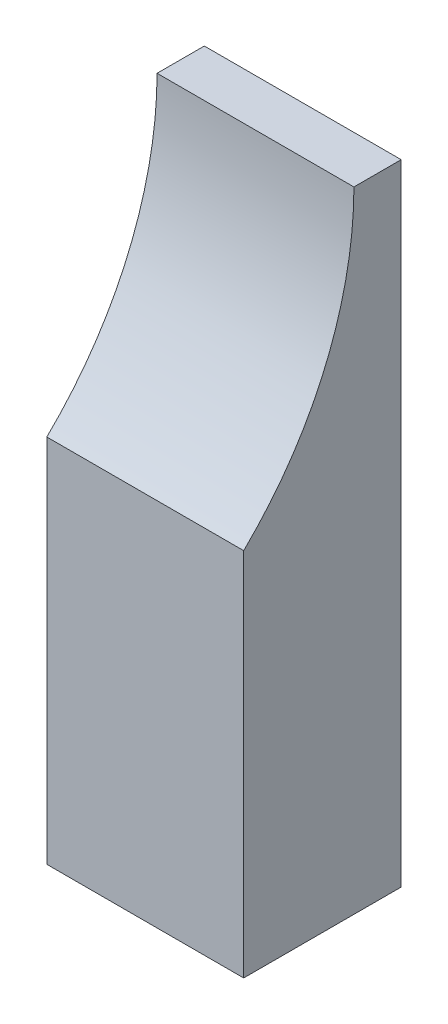
ISO-10303-21;
HEADER;
FILE_DESCRIPTION(('STEP AP214'),'2;1');
FILE_NAME('part.step','',(''),(''),'','','');
FILE_SCHEMA(('AUTOMOTIVE_DESIGN { 1 0 10303 214 1 1 1 1 }'));
ENDSEC;
DATA;
#1=APPLICATION_CONTEXT('core data for automotive mechanical design processes');
#2=APPLICATION_PROTOCOL_DEFINITION('international standard','automotive_design',2000,#1);
#3=PRODUCT_CONTEXT('',#1,'mechanical');
#4=PRODUCT('Part','Part','',(#3));
#5=PRODUCT_RELATED_PRODUCT_CATEGORY('part','',(#4));
#6=PRODUCT_DEFINITION_FORMATION('','',#4);
#7=PRODUCT_DEFINITION_CONTEXT('part definition',#1,'design');
#8=PRODUCT_DEFINITION('design','',#6,#7);
#9=PRODUCT_DEFINITION_SHAPE('','',#8);
#10=(LENGTH_UNIT() NAMED_UNIT(*) SI_UNIT(.MILLI.,.METRE.));
#11=(NAMED_UNIT(*) PLANE_ANGLE_UNIT() SI_UNIT($,.RADIAN.));
#12=(NAMED_UNIT(*) SI_UNIT($,.STERADIAN.) SOLID_ANGLE_UNIT());
#13=UNCERTAINTY_MEASURE_WITH_UNIT(LENGTH_MEASURE(1.E-05),#10,'distance_accuracy_value','');
#14=(GEOMETRIC_REPRESENTATION_CONTEXT(3) GLOBAL_UNCERTAINTY_ASSIGNED_CONTEXT((#13)) GLOBAL_UNIT_ASSIGNED_CONTEXT((#10,
#11,#12)) REPRESENTATION_CONTEXT('',''));
#15=CARTESIAN_POINT('',(0.,0.,0.));
#16=DIRECTION('',(0.,0.,1.));
#17=DIRECTION('',(1.,0.,0.));
#18=AXIS2_PLACEMENT_3D('',#15,#16,#17);
#19=CARTESIAN_POINT('',(0.,0.,0.2));
#20=DIRECTION('',(0.,0.,1.));
#21=DIRECTION('',(1.,0.,0.));
#22=AXIS2_PLACEMENT_3D('',#19,#20,#21);
#23=PLANE('',#22);
#24=DIRECTION('',(1.,0.,0.));
#25=VECTOR('',#24,1.);
#26=CARTESIAN_POINT('',(0.125,-0.4,0.2));
#27=LINE('',#26,#25);
#28=CARTESIAN_POINT('',(0.125,-0.4,0.200000000006667));
#29=VERTEX_POINT('',#28);
#30=CARTESIAN_POINT('',(-0.125,-0.4,0.2));
#31=VERTEX_POINT('',#30);
#32=EDGE_CURVE('E82',#29,#31,#27,.F.);
#33=ORIENTED_EDGE('',*,*,#32,.F.);
#34=DIRECTION('',(0.,1.,0.));
#35=VECTOR('',#34,1.);
#36=CARTESIAN_POINT('',(0.125,0.4,0.20000000001));
#37=LINE('',#36,#35);
#38=CARTESIAN_POINT('',(0.125,0.0699999999955797,0.200000000010092));
#39=VERTEX_POINT('',#38);
#40=EDGE_CURVE('E74',#39,#29,#37,.F.);
#41=ORIENTED_EDGE('',*,*,#40,.F.);
#42=DIRECTION('',(1.,0.,0.));
#43=VECTOR('',#42,1.);
#44=CARTESIAN_POINT('',(0.125,0.0699999999954906,0.200000000010185));
#45=LINE('',#44,#43);
#46=CARTESIAN_POINT('',(-0.125,0.070000000000412,0.200000000005092));
#47=VERTEX_POINT('',#46);
#48=EDGE_CURVE('E71',#39,#47,#45,.F.);
#49=ORIENTED_EDGE('',*,*,#48,.T.);
#50=DIRECTION('',(0.,1.,0.));
#51=VECTOR('',#50,1.);
#52=CARTESIAN_POINT('',(-0.125,-0.4,0.2));
#53=LINE('',#52,#51);
#54=EDGE_CURVE('E60',#31,#47,#53,.T.);
#55=ORIENTED_EDGE('',*,*,#54,.F.);
#56=EDGE_LOOP('',(#33,#41,#49,#55));
#57=FACE_BOUND('',#56,.T.);
#58=ADVANCED_FACE('F17',(#57),#23,.T.);
#59=CARTESIAN_POINT('',(0.125,0.4,0.518928571416));
#60=DIRECTION('',(1.,0.,0.));
#61=DIRECTION('',(0.,0.,-1.));
#62=AXIS2_PLACEMENT_3D('',#59,#60,#61);
#63=CYLINDRICAL_SURFACE('',#62,0.458928571416);
#64=CARTESIAN_POINT('',(-0.125,0.4,0.518928571416));
#65=DIRECTION('',(1.,0.,0.));
#66=DIRECTION('',(0.,0.,-1.));
#67=AXIS2_PLACEMENT_3D('',#64,#65,#66);
#68=CIRCLE('',#67,0.458928571416);
#69=CARTESIAN_POINT('',(-0.125,0.4,0.06));
#70=VERTEX_POINT('',#69);
#71=EDGE_CURVE('E20',#47,#70,#68,.T.);
#72=ORIENTED_EDGE('',*,*,#71,.F.);
#73=ORIENTED_EDGE('',*,*,#48,.F.);
#74=CARTESIAN_POINT('',(0.125,0.4,0.518928571416));
#75=DIRECTION('',(1.,0.,0.));
#76=DIRECTION('',(0.,0.,-1.));
#77=AXIS2_PLACEMENT_3D('',#74,#75,#76);
#78=CIRCLE('',#77,0.458928571416);
#79=CARTESIAN_POINT('',(0.125,0.4,0.06));
#80=VERTEX_POINT('',#79);
#81=EDGE_CURVE('E86',#80,#39,#78,.F.);
#82=ORIENTED_EDGE('',*,*,#81,.F.);
#83=DIRECTION('',(1.,0.,0.));
#84=VECTOR('',#83,1.);
#85=CARTESIAN_POINT('',(-0.125,0.4,0.06));
#86=LINE('',#85,#84);
#87=EDGE_CURVE('E81',#70,#80,#86,.T.);
#88=ORIENTED_EDGE('',*,*,#87,.F.);
#89=EDGE_LOOP('',(#72,#73,#82,#88));
#90=FACE_BOUND('',#89,.T.);
#91=ADVANCED_FACE('F80',(#90),#63,.F.);
#92=CARTESIAN_POINT('',(-0.125,-0.4,0.));
#93=DIRECTION('',(-1.,0.,0.));
#94=DIRECTION('',(0.,0.,1.));
#95=AXIS2_PLACEMENT_3D('',#92,#93,#94);
#96=PLANE('',#95);
#97=ORIENTED_EDGE('',*,*,#71,.T.);
#98=DIRECTION('',(0.,0.,1.));
#99=VECTOR('',#98,1.);
#100=CARTESIAN_POINT('',(-0.125,0.4,0.));
#101=LINE('',#100,#99);
#102=CARTESIAN_POINT('',(-0.125,0.4,0.));
#103=VERTEX_POINT('',#102);
#104=EDGE_CURVE('E96',#103,#70,#101,.T.);
#105=ORIENTED_EDGE('',*,*,#104,.F.);
#106=DIRECTION('',(0.,1.,0.));
#107=VECTOR('',#106,1.);
#108=CARTESIAN_POINT('',(-0.125,0.,0.));
#109=LINE('',#108,#107);
#110=CARTESIAN_POINT('',(-0.125,-0.4,0.));
#111=VERTEX_POINT('',#110);
#112=EDGE_CURVE('E111',#103,#111,#109,.F.);
#113=ORIENTED_EDGE('',*,*,#112,.T.);
#114=DIRECTION('',(0.,0.,-1.));
#115=VECTOR('',#114,1.);
#116=CARTESIAN_POINT('',(-0.125,-0.4,0.));
#117=LINE('',#116,#115);
#118=EDGE_CURVE('E68',#31,#111,#117,.T.);
#119=ORIENTED_EDGE('',*,*,#118,.F.);
#120=ORIENTED_EDGE('',*,*,#54,.T.);
#121=EDGE_LOOP('',(#97,#105,#113,#119,#120));
#122=FACE_BOUND('',#121,.T.);
#123=ADVANCED_FACE('F62',(#122),#96,.T.);
#124=CARTESIAN_POINT('',(0.125,-0.4,0.));
#125=DIRECTION('',(0.,-1.,0.));
#126=DIRECTION('',(0.,0.,-1.));
#127=AXIS2_PLACEMENT_3D('',#124,#125,#126);
#128=PLANE('',#127);
#129=ORIENTED_EDGE('',*,*,#118,.T.);
#130=DIRECTION('',(1.,0.,0.));
#131=VECTOR('',#130,1.);
#132=CARTESIAN_POINT('',(0.,-0.4,0.));
#133=LINE('',#132,#131);
#134=CARTESIAN_POINT('',(0.125,-0.4,0.));
#135=VERTEX_POINT('',#134);
#136=EDGE_CURVE('E104',#111,#135,#133,.T.);
#137=ORIENTED_EDGE('',*,*,#136,.T.);
#138=DIRECTION('',(0.,0.,-1.));
#139=VECTOR('',#138,1.);
#140=CARTESIAN_POINT('',(0.125,-0.4,0.));
#141=LINE('',#140,#139);
#142=EDGE_CURVE('E94',#29,#135,#141,.T.);
#143=ORIENTED_EDGE('',*,*,#142,.F.);
#144=ORIENTED_EDGE('',*,*,#32,.T.);
#145=EDGE_LOOP('',(#129,#137,#143,#144));
#146=FACE_BOUND('',#145,.T.);
#147=ADVANCED_FACE('F124',(#146),#128,.T.);
#148=CARTESIAN_POINT('',(0.125,0.4,0.));
#149=DIRECTION('',(1.,0.,0.));
#150=DIRECTION('',(0.,0.,-1.));
#151=AXIS2_PLACEMENT_3D('',#148,#149,#150);
#152=PLANE('',#151);
#153=ORIENTED_EDGE('',*,*,#40,.T.);
#154=ORIENTED_EDGE('',*,*,#142,.T.);
#155=DIRECTION('',(0.,1.,0.));
#156=VECTOR('',#155,1.);
#157=CARTESIAN_POINT('',(0.125,0.,0.));
#158=LINE('',#157,#156);
#159=CARTESIAN_POINT('',(0.125,0.4,0.));
#160=VERTEX_POINT('',#159);
#161=EDGE_CURVE('E26',#135,#160,#158,.T.);
#162=ORIENTED_EDGE('',*,*,#161,.T.);
#163=DIRECTION('',(0.,0.,1.));
#164=VECTOR('',#163,1.);
#165=CARTESIAN_POINT('',(0.125,0.4,0.));
#166=LINE('',#165,#164);
#167=EDGE_CURVE('E34',#80,#160,#166,.F.);
#168=ORIENTED_EDGE('',*,*,#167,.F.);
#169=ORIENTED_EDGE('',*,*,#81,.T.);
#170=EDGE_LOOP('',(#153,#154,#162,#168,#169));
#171=FACE_BOUND('',#170,.T.);
#172=ADVANCED_FACE('F128',(#171),#152,.T.);
#173=CARTESIAN_POINT('',(-0.125,0.4,0.));
#174=DIRECTION('',(0.,1.,0.));
#175=DIRECTION('',(0.,0.,1.));
#176=AXIS2_PLACEMENT_3D('',#173,#174,#175);
#177=PLANE('',#176);
#178=ORIENTED_EDGE('',*,*,#87,.T.);
#179=ORIENTED_EDGE('',*,*,#167,.T.);
#180=DIRECTION('',(1.,0.,0.));
#181=VECTOR('',#180,1.);
#182=CARTESIAN_POINT('',(0.,0.4,0.));
#183=LINE('',#182,#181);
#184=EDGE_CURVE('E11',#160,#103,#183,.F.);
#185=ORIENTED_EDGE('',*,*,#184,.T.);
#186=ORIENTED_EDGE('',*,*,#104,.T.);
#187=EDGE_LOOP('',(#178,#179,#185,#186));
#188=FACE_BOUND('',#187,.T.);
#189=ADVANCED_FACE('F130',(#188),#177,.T.);
#190=CARTESIAN_POINT('',(0.,0.,0.));
#191=DIRECTION('',(0.,0.,1.));
#192=DIRECTION('',(1.,0.,0.));
#193=AXIS2_PLACEMENT_3D('',#190,#191,#192);
#194=PLANE('',#193);
#195=ORIENTED_EDGE('',*,*,#161,.F.);
#196=ORIENTED_EDGE('',*,*,#136,.F.);
#197=ORIENTED_EDGE('',*,*,#112,.F.);
#198=ORIENTED_EDGE('',*,*,#184,.F.);
#199=EDGE_LOOP('',(#195,#196,#197,#198));
#200=FACE_BOUND('',#199,.T.);
#201=ADVANCED_FACE('F127',(#200),#194,.F.);
#202=CLOSED_SHELL('',(#58,#91,#123,#147,#172,#189,#201));
#203=MANIFOLD_SOLID_BREP('B1',#202);
#204=ADVANCED_BREP_SHAPE_REPRESENTATION('',(#18,#203),#14);
#205=SHAPE_DEFINITION_REPRESENTATION(#9,#204);
ENDSEC;
END-ISO-10303-21;
